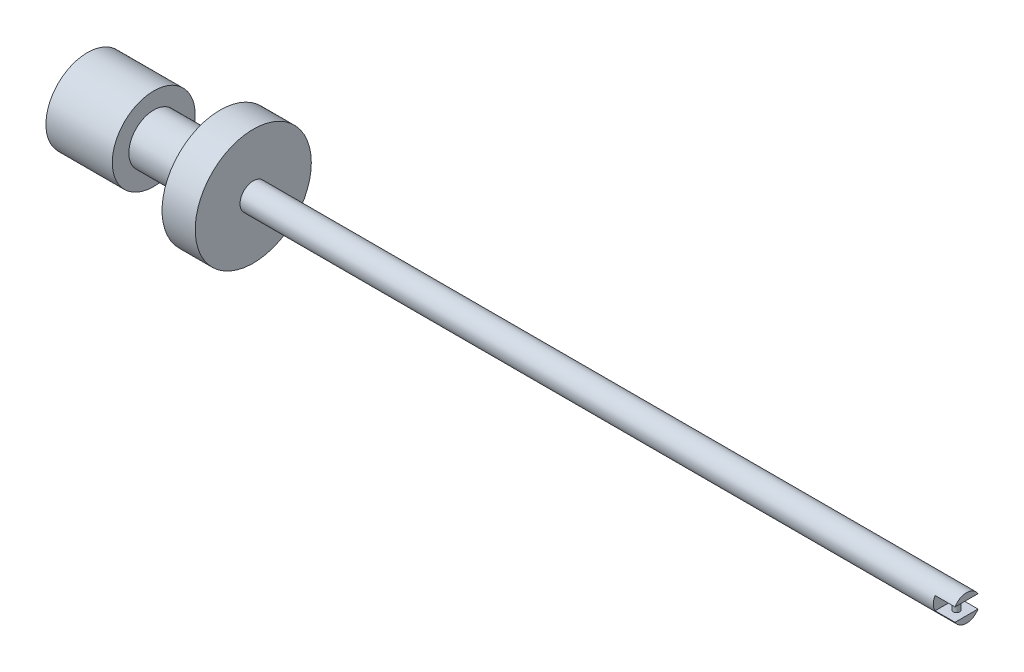
ISO-10303-21;
HEADER;
FILE_DESCRIPTION(('STEP AP214'),'2;1');
FILE_NAME('part.step','',(''),(''),'','','');
FILE_SCHEMA(('AUTOMOTIVE_DESIGN { 1 0 10303 214 1 1 1 1 }'));
ENDSEC;
DATA;
#1=APPLICATION_CONTEXT('core data for automotive mechanical design processes');
#2=APPLICATION_PROTOCOL_DEFINITION('international standard','automotive_design',2000,#1);
#3=PRODUCT_CONTEXT('',#1,'mechanical');
#4=PRODUCT('Part','Part','',(#3));
#5=PRODUCT_RELATED_PRODUCT_CATEGORY('part','',(#4));
#6=PRODUCT_DEFINITION_FORMATION('','',#4);
#7=PRODUCT_DEFINITION_CONTEXT('part definition',#1,'design');
#8=PRODUCT_DEFINITION('design','',#6,#7);
#9=PRODUCT_DEFINITION_SHAPE('','',#8);
#10=(LENGTH_UNIT() NAMED_UNIT(*) SI_UNIT(.MILLI.,.METRE.));
#11=(NAMED_UNIT(*) PLANE_ANGLE_UNIT() SI_UNIT($,.RADIAN.));
#12=(NAMED_UNIT(*) SI_UNIT($,.STERADIAN.) SOLID_ANGLE_UNIT());
#13=UNCERTAINTY_MEASURE_WITH_UNIT(LENGTH_MEASURE(1.E-05),#10,'distance_accuracy_value','');
#14=(GEOMETRIC_REPRESENTATION_CONTEXT(3) GLOBAL_UNCERTAINTY_ASSIGNED_CONTEXT((#13)) GLOBAL_UNIT_ASSIGNED_CONTEXT((#10,
#11,#12)) REPRESENTATION_CONTEXT('',''));
#15=CARTESIAN_POINT('',(0.,0.,0.));
#16=DIRECTION('',(0.,0.,1.));
#17=DIRECTION('',(1.,0.,0.));
#18=AXIS2_PLACEMENT_3D('',#15,#16,#17);
#19=CARTESIAN_POINT('',(265.,0.,0.));
#20=DIRECTION('',(1.,0.,0.));
#21=DIRECTION('',(0.,0.,-1.));
#22=AXIS2_PLACEMENT_3D('',#19,#20,#21);
#23=PLANE('',#22);
#24=DIRECTION('',(0.,0.,1.));
#25=VECTOR('',#24,1.);
#26=CARTESIAN_POINT('',(265.,2.,0.));
#27=LINE('',#26,#25);
#28=CARTESIAN_POINT('',(265.,2.,-3.46410161513776));
#29=VERTEX_POINT('',#28);
#30=CARTESIAN_POINT('',(265.,2.,3.46410161513775));
#31=VERTEX_POINT('',#30);
#32=EDGE_CURVE('E89',#29,#31,#27,.T.);
#33=ORIENTED_EDGE('',*,*,#32,.F.);
#34=CARTESIAN_POINT('',(265.,0.,0.));
#35=DIRECTION('',(1.,0.,0.));
#36=DIRECTION('',(0.,0.,-1.));
#37=AXIS2_PLACEMENT_3D('',#34,#35,#36);
#38=CIRCLE('',#37,4.);
#39=EDGE_CURVE('E105',#29,#31,#38,.T.);
#40=ORIENTED_EDGE('',*,*,#39,.T.);
#41=EDGE_LOOP('',(#33,#40));
#42=FACE_BOUND('',#41,.T.);
#43=ADVANCED_FACE('F39',(#42),#23,.T.);
#44=CARTESIAN_POINT('',(20.,0.,0.));
#45=DIRECTION('',(-1.,0.,0.));
#46=DIRECTION('',(0.,0.,1.));
#47=AXIS2_PLACEMENT_3D('',#44,#45,#46);
#48=CYLINDRICAL_SURFACE('',#47,12.5);
#49=CARTESIAN_POINT('',(20.,0.,0.));
#50=DIRECTION('',(1.,0.,0.));
#51=DIRECTION('',(0.,0.,-1.));
#52=AXIS2_PLACEMENT_3D('',#49,#50,#51);
#53=CIRCLE('',#52,12.5);
#54=CARTESIAN_POINT('',(20.,0.,-12.5));
#55=VERTEX_POINT('',#54);
#56=EDGE_CURVE('E134',#55,#55,#53,.T.);
#57=ORIENTED_EDGE('',*,*,#56,.F.);
#58=EDGE_LOOP('',(#57));
#59=FACE_BOUND('',#58,.T.);
#60=CARTESIAN_POINT('',(0.,0.,0.));
#61=DIRECTION('',(1.,0.,0.));
#62=DIRECTION('',(0.,0.,-1.));
#63=AXIS2_PLACEMENT_3D('',#60,#61,#62);
#64=CIRCLE('',#63,12.5);
#65=CARTESIAN_POINT('',(0.,0.,-12.5));
#66=VERTEX_POINT('',#65);
#67=EDGE_CURVE('E130',#66,#66,#64,.T.);
#68=ORIENTED_EDGE('',*,*,#67,.T.);
#69=EDGE_LOOP('',(#68));
#70=FACE_BOUND('',#69,.T.);
#71=ADVANCED_FACE('F41',(#59,#70),#48,.T.);
#72=CARTESIAN_POINT('',(20.,0.,0.));
#73=DIRECTION('',(1.,0.,0.));
#74=DIRECTION('',(0.,0.,-1.));
#75=AXIS2_PLACEMENT_3D('',#72,#73,#74);
#76=PLANE('',#75);
#77=CARTESIAN_POINT('',(20.,0.,0.));
#78=DIRECTION('',(1.,0.,0.));
#79=DIRECTION('',(0.,0.,-1.));
#80=AXIS2_PLACEMENT_3D('',#77,#78,#79);
#81=CIRCLE('',#80,7.5);
#82=CARTESIAN_POINT('',(20.,0.,-7.5));
#83=VERTEX_POINT('',#82);
#84=EDGE_CURVE('E118',#83,#83,#81,.T.);
#85=ORIENTED_EDGE('',*,*,#84,.F.);
#86=EDGE_LOOP('',(#85));
#87=FACE_BOUND('',#86,.T.);
#88=ORIENTED_EDGE('',*,*,#56,.T.);
#89=EDGE_LOOP('',(#88));
#90=FACE_BOUND('',#89,.T.);
#91=ADVANCED_FACE('F171',(#87,#90),#76,.T.);
#92=CARTESIAN_POINT('',(0.,0.,0.));
#93=DIRECTION('',(1.,0.,0.));
#94=DIRECTION('',(0.,0.,-1.));
#95=AXIS2_PLACEMENT_3D('',#92,#93,#94);
#96=PLANE('',#95);
#97=ORIENTED_EDGE('',*,*,#67,.F.);
#98=EDGE_LOOP('',(#97));
#99=FACE_BOUND('',#98,.T.);
#100=ADVANCED_FACE('F200',(#99),#96,.F.);
#101=CARTESIAN_POINT('',(40.,0.,0.));
#102=DIRECTION('',(-1.,0.,0.));
#103=DIRECTION('',(0.,0.,1.));
#104=AXIS2_PLACEMENT_3D('',#101,#102,#103);
#105=CYLINDRICAL_SURFACE('',#104,7.5);
#106=CARTESIAN_POINT('',(40.,0.,0.));
#107=DIRECTION('',(1.,0.,0.));
#108=DIRECTION('',(0.,0.,-1.));
#109=AXIS2_PLACEMENT_3D('',#106,#107,#108);
#110=CIRCLE('',#109,7.5);
#111=CARTESIAN_POINT('',(40.,0.,-7.5));
#112=VERTEX_POINT('',#111);
#113=EDGE_CURVE('E123',#112,#112,#110,.T.);
#114=ORIENTED_EDGE('',*,*,#113,.F.);
#115=EDGE_LOOP('',(#114));
#116=FACE_BOUND('',#115,.T.);
#117=ORIENTED_EDGE('',*,*,#84,.T.);
#118=EDGE_LOOP('',(#117));
#119=FACE_BOUND('',#118,.T.);
#120=ADVANCED_FACE('F196',(#116,#119),#105,.T.);
#121=CARTESIAN_POINT('',(50.,0.,0.));
#122=DIRECTION('',(-1.,0.,0.));
#123=DIRECTION('',(0.,0.,1.));
#124=AXIS2_PLACEMENT_3D('',#121,#122,#123);
#125=CYLINDRICAL_SURFACE('',#124,17.5);
#126=CARTESIAN_POINT('',(50.,0.,0.));
#127=DIRECTION('',(1.,0.,0.));
#128=DIRECTION('',(0.,0.,-1.));
#129=AXIS2_PLACEMENT_3D('',#126,#127,#128);
#130=CIRCLE('',#129,17.5);
#131=CARTESIAN_POINT('',(50.,0.,-17.5));
#132=VERTEX_POINT('',#131);
#133=EDGE_CURVE('E119',#132,#132,#130,.T.);
#134=ORIENTED_EDGE('',*,*,#133,.F.);
#135=EDGE_LOOP('',(#134));
#136=FACE_BOUND('',#135,.T.);
#137=CARTESIAN_POINT('',(40.,0.,0.));
#138=DIRECTION('',(1.,0.,0.));
#139=DIRECTION('',(0.,0.,-1.));
#140=AXIS2_PLACEMENT_3D('',#137,#138,#139);
#141=CIRCLE('',#140,17.5);
#142=CARTESIAN_POINT('',(40.,0.,-17.5));
#143=VERTEX_POINT('',#142);
#144=EDGE_CURVE('E111',#143,#143,#141,.T.);
#145=ORIENTED_EDGE('',*,*,#144,.T.);
#146=EDGE_LOOP('',(#145));
#147=FACE_BOUND('',#146,.T.);
#148=ADVANCED_FACE('F191',(#136,#147),#125,.T.);
#149=CARTESIAN_POINT('',(50.,0.,0.));
#150=DIRECTION('',(1.,0.,0.));
#151=DIRECTION('',(0.,0.,-1.));
#152=AXIS2_PLACEMENT_3D('',#149,#150,#151);
#153=PLANE('',#152);
#154=CARTESIAN_POINT('',(50.,0.,0.));
#155=DIRECTION('',(1.,0.,0.));
#156=DIRECTION('',(0.,0.,-1.));
#157=AXIS2_PLACEMENT_3D('',#154,#155,#156);
#158=CIRCLE('',#157,4.);
#159=CARTESIAN_POINT('',(50.,0.,-4.));
#160=VERTEX_POINT('',#159);
#161=EDGE_CURVE('E90',#160,#160,#158,.T.);
#162=ORIENTED_EDGE('',*,*,#161,.F.);
#163=EDGE_LOOP('',(#162));
#164=FACE_BOUND('',#163,.T.);
#165=ORIENTED_EDGE('',*,*,#133,.T.);
#166=EDGE_LOOP('',(#165));
#167=FACE_BOUND('',#166,.T.);
#168=ADVANCED_FACE('F186',(#164,#167),#153,.T.);
#169=CARTESIAN_POINT('',(40.,0.,0.));
#170=DIRECTION('',(1.,0.,0.));
#171=DIRECTION('',(0.,0.,-1.));
#172=AXIS2_PLACEMENT_3D('',#169,#170,#171);
#173=PLANE('',#172);
#174=ORIENTED_EDGE('',*,*,#113,.T.);
#175=EDGE_LOOP('',(#174));
#176=FACE_BOUND('',#175,.T.);
#177=ORIENTED_EDGE('',*,*,#144,.F.);
#178=EDGE_LOOP('',(#177));
#179=FACE_BOUND('',#178,.T.);
#180=ADVANCED_FACE('F182',(#176,#179),#173,.F.);
#181=CARTESIAN_POINT('',(265.,0.,0.));
#182=DIRECTION('',(-1.,0.,0.));
#183=DIRECTION('',(0.,0.,1.));
#184=AXIS2_PLACEMENT_3D('',#181,#182,#183);
#185=CYLINDRICAL_SURFACE('',#184,4.);
#186=ORIENTED_EDGE('',*,*,#39,.F.);
#187=DIRECTION('',(-1.,0.,0.));
#188=VECTOR('',#187,1.);
#189=CARTESIAN_POINT('',(265.,2.,-3.46410161513775));
#190=LINE('',#189,#188);
#191=CARTESIAN_POINT('',(259.,2.,-3.46410161513775));
#192=VERTEX_POINT('',#191);
#193=EDGE_CURVE('E106',#29,#192,#190,.T.);
#194=ORIENTED_EDGE('',*,*,#193,.T.);
#195=CARTESIAN_POINT('',(259.,0.,0.));
#196=DIRECTION('',(-1.,0.,0.));
#197=DIRECTION('',(0.,0.,1.));
#198=AXIS2_PLACEMENT_3D('',#195,#196,#197);
#199=CIRCLE('',#198,4.);
#200=CARTESIAN_POINT('',(259.,-2.,-3.46410161513775));
#201=VERTEX_POINT('',#200);
#202=EDGE_CURVE('E99',#192,#201,#199,.T.);
#203=ORIENTED_EDGE('',*,*,#202,.T.);
#204=DIRECTION('',(-1.,0.,0.));
#205=VECTOR('',#204,1.);
#206=CARTESIAN_POINT('',(265.,-2.,-3.46410161513775));
#207=LINE('',#206,#205);
#208=CARTESIAN_POINT('',(265.,-2.,-3.46410161513776));
#209=VERTEX_POINT('',#208);
#210=EDGE_CURVE('E83',#201,#209,#207,.F.);
#211=ORIENTED_EDGE('',*,*,#210,.T.);
#212=CARTESIAN_POINT('',(265.,-2.,3.46410161513775));
#213=VERTEX_POINT('',#212);
#214=EDGE_CURVE('E97',#213,#209,#38,.T.);
#215=ORIENTED_EDGE('',*,*,#214,.F.);
#216=DIRECTION('',(-1.,0.,0.));
#217=VECTOR('',#216,1.);
#218=CARTESIAN_POINT('',(265.,-2.,3.46410161513775));
#219=LINE('',#218,#217);
#220=CARTESIAN_POINT('',(259.,-2.,3.46410161513775));
#221=VERTEX_POINT('',#220);
#222=EDGE_CURVE('E55',#213,#221,#219,.T.);
#223=ORIENTED_EDGE('',*,*,#222,.T.);
#224=CARTESIAN_POINT('',(259.,2.,3.46410161513775));
#225=VERTEX_POINT('',#224);
#226=EDGE_CURVE('E143',#221,#225,#199,.T.);
#227=ORIENTED_EDGE('',*,*,#226,.T.);
#228=DIRECTION('',(-1.,0.,0.));
#229=VECTOR('',#228,1.);
#230=CARTESIAN_POINT('',(265.,2.,3.46410161513775));
#231=LINE('',#230,#229);
#232=EDGE_CURVE('E63',#225,#31,#231,.F.);
#233=ORIENTED_EDGE('',*,*,#232,.T.);
#234=EDGE_LOOP('',(#186,#194,#203,#211,#215,#223,#227,#233));
#235=FACE_BOUND('',#234,.T.);
#236=ORIENTED_EDGE('',*,*,#161,.T.);
#237=EDGE_LOOP('',(#236));
#238=FACE_BOUND('',#237,.T.);
#239=ADVANCED_FACE('F95',(#235,#238),#185,.T.);
#240=DIRECTION('',(0.,0.,-1.));
#241=VECTOR('',#240,1.);
#242=CARTESIAN_POINT('',(265.,-2.,0.));
#243=LINE('',#242,#241);
#244=EDGE_CURVE('E80',#213,#209,#243,.T.);
#245=ORIENTED_EDGE('',*,*,#244,.F.);
#246=ORIENTED_EDGE('',*,*,#214,.T.);
#247=EDGE_LOOP('',(#245,#246));
#248=FACE_BOUND('',#247,.T.);
#249=ADVANCED_FACE('F103',(#248),#23,.T.);
#250=CARTESIAN_POINT('',(259.,0.,0.));
#251=DIRECTION('',(-1.,0.,0.));
#252=DIRECTION('',(0.,0.,1.));
#253=AXIS2_PLACEMENT_3D('',#250,#251,#252);
#254=PLANE('',#253);
#255=DIRECTION('',(0.,0.,1.));
#256=VECTOR('',#255,1.);
#257=CARTESIAN_POINT('',(259.,2.,6.));
#258=LINE('',#257,#256);
#259=EDGE_CURVE('E101',#192,#225,#258,.T.);
#260=ORIENTED_EDGE('',*,*,#259,.T.);
#261=ORIENTED_EDGE('',*,*,#226,.F.);
#262=DIRECTION('',(0.,0.,-1.));
#263=VECTOR('',#262,1.);
#264=CARTESIAN_POINT('',(259.,-2.,6.));
#265=LINE('',#264,#263);
#266=EDGE_CURVE('E296',#221,#201,#265,.T.);
#267=ORIENTED_EDGE('',*,*,#266,.T.);
#268=ORIENTED_EDGE('',*,*,#202,.F.);
#269=EDGE_LOOP('',(#260,#261,#267,#268));
#270=FACE_BOUND('',#269,.T.);
#271=ADVANCED_FACE('F162',(#270),#254,.F.);
#272=CARTESIAN_POINT('',(259.,2.,6.));
#273=DIRECTION('',(0.,1.,0.));
#274=DIRECTION('',(0.,0.,1.));
#275=AXIS2_PLACEMENT_3D('',#272,#273,#274);
#276=PLANE('',#275);
#277=CARTESIAN_POINT('',(262.,2.,0.));
#278=DIRECTION('',(0.,1.,0.));
#279=DIRECTION('',(0.,0.,1.));
#280=AXIS2_PLACEMENT_3D('',#277,#278,#279);
#281=CIRCLE('',#280,0.999999999999998);
#282=CARTESIAN_POINT('',(262.,2.,-0.999999999999998));
#283=VERTEX_POINT('',#282);
#284=EDGE_CURVE('E11',#283,#283,#281,.F.);
#285=ORIENTED_EDGE('',*,*,#284,.F.);
#286=EDGE_LOOP('',(#285));
#287=FACE_BOUND('',#286,.T.);
#288=ORIENTED_EDGE('',*,*,#32,.T.);
#289=ORIENTED_EDGE('',*,*,#232,.F.);
#290=ORIENTED_EDGE('',*,*,#259,.F.);
#291=ORIENTED_EDGE('',*,*,#193,.F.);
#292=EDGE_LOOP('',(#288,#289,#290,#291));
#293=FACE_BOUND('',#292,.T.);
#294=ADVANCED_FACE('F155',(#287,#293),#276,.F.);
#295=CARTESIAN_POINT('',(259.,-2.,6.));
#296=DIRECTION('',(0.,-1.,0.));
#297=DIRECTION('',(0.,0.,-1.));
#298=AXIS2_PLACEMENT_3D('',#295,#296,#297);
#299=PLANE('',#298);
#300=CARTESIAN_POINT('',(262.,-2.,0.));
#301=DIRECTION('',(0.,-1.,0.));
#302=DIRECTION('',(0.,0.,-1.));
#303=AXIS2_PLACEMENT_3D('',#300,#301,#302);
#304=CIRCLE('',#303,0.999999999999998);
#305=CARTESIAN_POINT('',(262.,-2.,-0.999999999999998));
#306=VERTEX_POINT('',#305);
#307=EDGE_CURVE('E48',#306,#306,#304,.F.);
#308=ORIENTED_EDGE('',*,*,#307,.F.);
#309=EDGE_LOOP('',(#308));
#310=FACE_BOUND('',#309,.T.);
#311=ORIENTED_EDGE('',*,*,#244,.T.);
#312=ORIENTED_EDGE('',*,*,#210,.F.);
#313=ORIENTED_EDGE('',*,*,#266,.F.);
#314=ORIENTED_EDGE('',*,*,#222,.F.);
#315=EDGE_LOOP('',(#311,#312,#313,#314));
#316=FACE_BOUND('',#315,.T.);
#317=ADVANCED_FACE('F82',(#310,#316),#299,.F.);
#318=CARTESIAN_POINT('',(262.,4.82842712474619,0.));
#319=DIRECTION('',(0.,-1.,0.));
#320=DIRECTION('',(0.,0.,-1.));
#321=AXIS2_PLACEMENT_3D('',#318,#319,#320);
#322=CYLINDRICAL_SURFACE('',#321,0.999999999999998);
#323=CARTESIAN_POINT('',(262.,-2.,-0.999999999999998));
#324=CARTESIAN_POINT('',(262.,-1.95833333333333,-0.999999999999998));
#325=CARTESIAN_POINT('',(262.,-1.91666666666667,-0.999999999999998));
#326=CARTESIAN_POINT('',(262.,-1.83333333333333,-0.999999999999998));
#327=CARTESIAN_POINT('',(262.,-1.79166666666667,-0.999999999999998));
#328=CARTESIAN_POINT('',(262.,-1.70833333333333,-0.999999999999998));
#329=CARTESIAN_POINT('',(262.,-1.66666666666667,-0.999999999999998));
#330=CARTESIAN_POINT('',(262.,-1.58333333333333,-0.999999999999998));
#331=CARTESIAN_POINT('',(262.,-1.54166666666667,-0.999999999999998));
#332=CARTESIAN_POINT('',(262.,-1.45833333333333,-0.999999999999998));
#333=CARTESIAN_POINT('',(262.,-1.41666666666667,-0.999999999999998));
#334=CARTESIAN_POINT('',(262.,-1.33333333333333,-0.999999999999998));
#335=CARTESIAN_POINT('',(262.,-1.29166666666667,-0.999999999999998));
#336=CARTESIAN_POINT('',(262.,-1.20833333333333,-0.999999999999998));
#337=CARTESIAN_POINT('',(262.,-1.16666666666667,-0.999999999999998));
#338=CARTESIAN_POINT('',(262.,-1.08333333333333,-0.999999999999998));
#339=CARTESIAN_POINT('',(262.,-1.04166666666667,-0.999999999999998));
#340=CARTESIAN_POINT('',(262.,-0.958333333333333,-0.999999999999998));
#341=CARTESIAN_POINT('',(262.,-0.916666666666666,-0.999999999999998));
#342=CARTESIAN_POINT('',(262.,-0.833333333333333,-0.999999999999998));
#343=CARTESIAN_POINT('',(262.,-0.791666666666667,-0.999999999999998));
#344=CARTESIAN_POINT('',(262.,-0.708333333333333,-0.999999999999998));
#345=CARTESIAN_POINT('',(262.,-0.666666666666666,-0.999999999999998));
#346=CARTESIAN_POINT('',(262.,-0.583333333333333,-0.999999999999998));
#347=CARTESIAN_POINT('',(262.,-0.541666666666666,-0.999999999999998));
#348=CARTESIAN_POINT('',(262.,-0.458333333333333,-0.999999999999998));
#349=CARTESIAN_POINT('',(262.,-0.416666666666666,-0.999999999999998));
#350=CARTESIAN_POINT('',(262.,-0.333333333333333,-0.999999999999998));
#351=CARTESIAN_POINT('',(262.,-0.291666666666666,-0.999999999999998));
#352=CARTESIAN_POINT('',(262.,-0.208333333333333,-0.999999999999998));
#353=CARTESIAN_POINT('',(262.,-0.166666666666666,-0.999999999999998));
#354=CARTESIAN_POINT('',(262.,-0.0833333333333325,-0.999999999999998));
#355=CARTESIAN_POINT('',(262.,-0.0416666666666658,-0.999999999999998));
#356=CARTESIAN_POINT('',(262.,0.0416666666666676,-0.999999999999998));
#357=CARTESIAN_POINT('',(262.,0.0833333333333343,-0.999999999999998));
#358=CARTESIAN_POINT('',(262.,0.166666666666667,-0.999999999999998));
#359=CARTESIAN_POINT('',(262.,0.208333333333334,-0.999999999999998));
#360=CARTESIAN_POINT('',(262.,0.291666666666667,-0.999999999999998));
#361=CARTESIAN_POINT('',(262.,0.333333333333334,-0.999999999999998));
#362=CARTESIAN_POINT('',(262.,0.416666666666667,-0.999999999999998));
#363=CARTESIAN_POINT('',(262.,0.458333333333334,-0.999999999999998));
#364=CARTESIAN_POINT('',(262.,0.541666666666667,-0.999999999999998));
#365=CARTESIAN_POINT('',(262.,0.583333333333333,-0.999999999999998));
#366=CARTESIAN_POINT('',(262.,0.666666666666666,-0.999999999999998));
#367=CARTESIAN_POINT('',(262.,0.708333333333333,-0.999999999999998));
#368=CARTESIAN_POINT('',(262.,0.791666666666667,-0.999999999999998));
#369=CARTESIAN_POINT('',(262.,0.833333333333333,-0.999999999999998));
#370=CARTESIAN_POINT('',(262.,0.916666666666666,-0.999999999999998));
#371=CARTESIAN_POINT('',(262.,0.958333333333333,-0.999999999999998));
#372=CARTESIAN_POINT('',(262.,1.04166666666667,-0.999999999999998));
#373=CARTESIAN_POINT('',(262.,1.08333333333333,-0.999999999999998));
#374=CARTESIAN_POINT('',(262.,1.16666666666667,-0.999999999999998));
#375=CARTESIAN_POINT('',(262.,1.20833333333333,-0.999999999999998));
#376=CARTESIAN_POINT('',(262.,1.29166666666667,-0.999999999999998));
#377=CARTESIAN_POINT('',(262.,1.33333333333333,-0.999999999999998));
#378=CARTESIAN_POINT('',(262.,1.41666666666667,-0.999999999999998));
#379=CARTESIAN_POINT('',(262.,1.45833333333333,-0.999999999999998));
#380=CARTESIAN_POINT('',(262.,1.54166666666667,-0.999999999999998));
#381=CARTESIAN_POINT('',(262.,1.58333333333333,-0.999999999999998));
#382=CARTESIAN_POINT('',(262.,1.66666666666667,-0.999999999999998));
#383=CARTESIAN_POINT('',(262.,1.70833333333333,-0.999999999999998));
#384=CARTESIAN_POINT('',(262.,1.79166666666667,-0.999999999999998));
#385=CARTESIAN_POINT('',(262.,1.83333333333333,-0.999999999999998));
#386=CARTESIAN_POINT('',(262.,1.91666666666667,-0.999999999999998));
#387=CARTESIAN_POINT('',(262.,1.95833333333333,-0.999999999999998));
#388=CARTESIAN_POINT('',(262.,2.,-0.999999999999998));
#389=B_SPLINE_CURVE_WITH_KNOTS('',3,(#323,#324,#325,#326,#327,#328,#329,#330,#331,#332,#333,
#334,#335,#336,#337,#338,#339,#340,#341,#342,#343,#344,#345,#346,#347,#348,#349,#350,#351,#352,
#353,#354,#355,#356,#357,#358,#359,#360,#361,#362,#363,#364,#365,#366,#367,#368,#369,#370,#371,
#372,#373,#374,#375,#376,#377,#378,#379,#380,#381,#382,#383,#384,#385,#386,#387,#388),
.UNSPECIFIED.,.F.,.F.,(4,2,2,2,2,2,2,2,2,2,2,2,2,2,2,2,2,2,2,2,2,2,2,2,2,2,2,2,2,2,2,2,4),(0.,
0.125,0.25,0.375,0.5,0.625,0.75,0.875,1.,1.125,1.25,1.375,1.5,1.625,1.75,1.875,2.,2.125,2.25,
2.375,2.5,2.625,2.75,2.875,3.,3.125,3.25,3.375,3.5,3.625,3.75,3.875,4.),.UNSPECIFIED.);
#390=EDGE_CURVE('BSEAM151',#306,#283,#389,.T.);
#391=ORIENTED_EDGE('',*,*,#307,.T.);
#392=ORIENTED_EDGE('',*,*,#284,.T.);
#393=ORIENTED_EDGE('',*,*,#390,.T.);
#394=ORIENTED_EDGE('',*,*,#390,.F.);
#395=EDGE_LOOP('',(#391,#393,#392,#394));
#396=FACE_BOUND('',#395,.T.);
#397=ADVANCED_FACE('F151',(#396),#322,.T.);
#398=CLOSED_SHELL('',(#43,#71,#91,#100,#120,#148,#168,#180,#239,#249,#271,#294,#317,#397));
#399=MANIFOLD_SOLID_BREP('B2',#398);
#400=ADVANCED_BREP_SHAPE_REPRESENTATION('',(#18,#399),#14);
#401=SHAPE_DEFINITION_REPRESENTATION(#9,#400);
ENDSEC;
END-ISO-10303-21;
